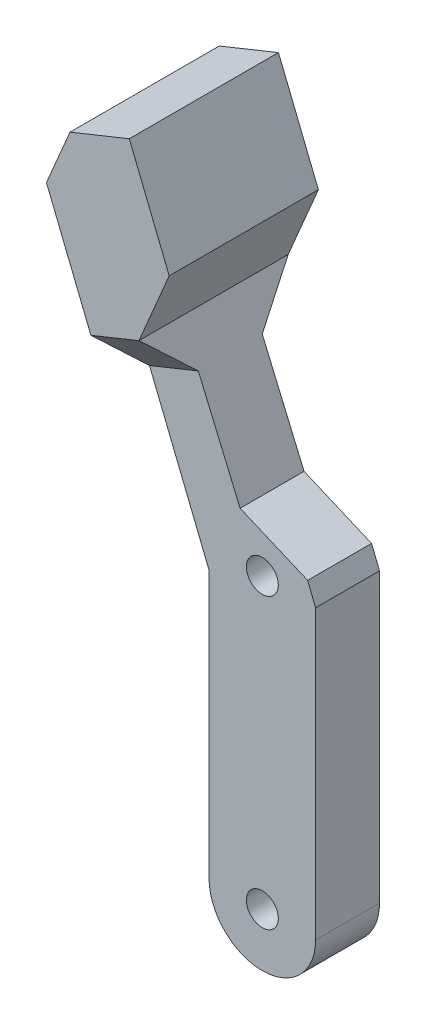
ISO-10303-21;
HEADER;
FILE_DESCRIPTION(('STEP AP214'),'2;1');
FILE_NAME('part.step','',(''),(''),'','','');
FILE_SCHEMA(('AUTOMOTIVE_DESIGN { 1 0 10303 214 1 1 1 1 }'));
ENDSEC;
DATA;
#1=APPLICATION_CONTEXT('core data for automotive mechanical design processes');
#2=APPLICATION_PROTOCOL_DEFINITION('international standard','automotive_design',2000,#1);
#3=PRODUCT_CONTEXT('',#1,'mechanical');
#4=PRODUCT('Part','Part','',(#3));
#5=PRODUCT_RELATED_PRODUCT_CATEGORY('part','',(#4));
#6=PRODUCT_DEFINITION_FORMATION('','',#4);
#7=PRODUCT_DEFINITION_CONTEXT('part definition',#1,'design');
#8=PRODUCT_DEFINITION('design','',#6,#7);
#9=PRODUCT_DEFINITION_SHAPE('','',#8);
#10=(LENGTH_UNIT() NAMED_UNIT(*) SI_UNIT(.MILLI.,.METRE.));
#11=(NAMED_UNIT(*) PLANE_ANGLE_UNIT() SI_UNIT($,.RADIAN.));
#12=(NAMED_UNIT(*) SI_UNIT($,.STERADIAN.) SOLID_ANGLE_UNIT());
#13=UNCERTAINTY_MEASURE_WITH_UNIT(LENGTH_MEASURE(1.E-05),#10,'distance_accuracy_value','');
#14=(GEOMETRIC_REPRESENTATION_CONTEXT(3) GLOBAL_UNCERTAINTY_ASSIGNED_CONTEXT((#13)) GLOBAL_UNIT_ASSIGNED_CONTEXT((#10,
#11,#12)) REPRESENTATION_CONTEXT('',''));
#15=CARTESIAN_POINT('',(0.,0.,0.));
#16=DIRECTION('',(0.,0.,1.));
#17=DIRECTION('',(1.,0.,0.));
#18=AXIS2_PLACEMENT_3D('',#15,#16,#17);
#19=CARTESIAN_POINT('',(0.,0.,6.));
#20=DIRECTION('',(0.,0.,-1.));
#21=DIRECTION('',(-1.,0.,0.));
#22=AXIS2_PLACEMENT_3D('',#19,#20,#21);
#23=CYLINDRICAL_SURFACE('',#22,5.);
#24=CARTESIAN_POINT('',(0.,0.,0.));
#25=DIRECTION('',(0.,0.,1.));
#26=DIRECTION('',(1.,0.,0.));
#27=AXIS2_PLACEMENT_3D('',#24,#25,#26);
#28=CIRCLE('',#27,5.);
#29=CARTESIAN_POINT('',(-5.,0.,0.));
#30=VERTEX_POINT('',#29);
#31=CARTESIAN_POINT('',(5.,0.,0.));
#32=VERTEX_POINT('',#31);
#33=EDGE_CURVE('E197',#30,#32,#28,.T.);
#34=ORIENTED_EDGE('',*,*,#33,.T.);
#35=DIRECTION('',(0.,0.,-1.));
#36=VECTOR('',#35,1.);
#37=CARTESIAN_POINT('',(5.,0.,6.));
#38=LINE('',#37,#36);
#39=CARTESIAN_POINT('',(5.,0.,6.));
#40=VERTEX_POINT('',#39);
#41=EDGE_CURVE('E249',#40,#32,#38,.T.);
#42=ORIENTED_EDGE('',*,*,#41,.F.);
#43=CARTESIAN_POINT('',(0.,0.,6.));
#44=DIRECTION('',(0.,0.,1.));
#45=DIRECTION('',(1.,0.,0.));
#46=AXIS2_PLACEMENT_3D('',#43,#44,#45);
#47=CIRCLE('',#46,5.);
#48=CARTESIAN_POINT('',(-5.,0.,6.));
#49=VERTEX_POINT('',#48);
#50=EDGE_CURVE('E206',#49,#40,#47,.T.);
#51=ORIENTED_EDGE('',*,*,#50,.F.);
#52=DIRECTION('',(0.,0.,-1.));
#53=VECTOR('',#52,1.);
#54=CARTESIAN_POINT('',(-5.,0.,6.));
#55=LINE('',#54,#53);
#56=EDGE_CURVE('E218',#49,#30,#55,.T.);
#57=ORIENTED_EDGE('',*,*,#56,.T.);
#58=EDGE_LOOP('',(#34,#42,#51,#57));
#59=FACE_BOUND('',#58,.T.);
#60=ADVANCED_FACE('F43',(#59),#23,.T.);
#61=CARTESIAN_POINT('',(5.,0.,6.));
#62=DIRECTION('',(-1.,0.,0.));
#63=DIRECTION('',(0.,0.,1.));
#64=AXIS2_PLACEMENT_3D('',#61,#62,#63);
#65=PLANE('',#64);
#66=DIRECTION('',(0.,1.,0.));
#67=VECTOR('',#66,1.);
#68=CARTESIAN_POINT('',(5.,0.,0.));
#69=LINE('',#68,#67);
#70=CARTESIAN_POINT('',(5.,27.,0.));
#71=VERTEX_POINT('',#70);
#72=EDGE_CURVE('E221',#32,#71,#69,.T.);
#73=ORIENTED_EDGE('',*,*,#72,.T.);
#74=DIRECTION('',(0.,0.,-1.));
#75=VECTOR('',#74,1.);
#76=CARTESIAN_POINT('',(5.,27.,6.));
#77=LINE('',#76,#75);
#78=CARTESIAN_POINT('',(5.,27.,6.));
#79=VERTEX_POINT('',#78);
#80=EDGE_CURVE('E246',#79,#71,#77,.T.);
#81=ORIENTED_EDGE('',*,*,#80,.F.);
#82=DIRECTION('',(0.,1.,0.));
#83=VECTOR('',#82,1.);
#84=CARTESIAN_POINT('',(5.,0.,6.));
#85=LINE('',#84,#83);
#86=EDGE_CURVE('E209',#40,#79,#85,.T.);
#87=ORIENTED_EDGE('',*,*,#86,.F.);
#88=ORIENTED_EDGE('',*,*,#41,.T.);
#89=EDGE_LOOP('',(#73,#81,#87,#88));
#90=FACE_BOUND('',#89,.T.);
#91=ADVANCED_FACE('F295',(#90),#65,.F.);
#92=CARTESIAN_POINT('',(5.,27.,6.));
#93=DIRECTION('',(-0.927183854566787,-0.374606593415913,0.));
#94=DIRECTION('',(0.374606593415913,-0.927183854566787,0.));
#95=AXIS2_PLACEMENT_3D('',#92,#93,#94);
#96=PLANE('',#95);
#97=DIRECTION('',(-0.374606593415913,0.927183854566787,0.));
#98=VECTOR('',#97,1.);
#99=CARTESIAN_POINT('',(5.,27.,0.));
#100=LINE('',#99,#98);
#101=CARTESIAN_POINT('',(4.25078681316817,28.8543677091336,0.));
#102=VERTEX_POINT('',#101);
#103=EDGE_CURVE('E223',#71,#102,#100,.T.);
#104=ORIENTED_EDGE('',*,*,#103,.T.);
#105=DIRECTION('',(0.,0.,-1.));
#106=VECTOR('',#105,1.);
#107=CARTESIAN_POINT('',(4.25078681316817,28.8543677091336,6.));
#108=LINE('',#107,#106);
#109=CARTESIAN_POINT('',(4.25078681316817,28.8543677091336,6.));
#110=VERTEX_POINT('',#109);
#111=EDGE_CURVE('E243',#110,#102,#108,.T.);
#112=ORIENTED_EDGE('',*,*,#111,.F.);
#113=DIRECTION('',(-0.374606593415913,0.927183854566787,0.));
#114=VECTOR('',#113,1.);
#115=CARTESIAN_POINT('',(5.,27.,6.));
#116=LINE('',#115,#114);
#117=EDGE_CURVE('E212',#79,#110,#116,.T.);
#118=ORIENTED_EDGE('',*,*,#117,.F.);
#119=ORIENTED_EDGE('',*,*,#80,.T.);
#120=EDGE_LOOP('',(#104,#112,#118,#119));
#121=FACE_BOUND('',#120,.T.);
#122=ADVANCED_FACE('F301',(#121),#96,.F.);
#123=CARTESIAN_POINT('',(4.25078681316817,28.8543677091336,6.));
#124=DIRECTION('',(-0.39073112848927,-0.920504853452442,0.));
#125=DIRECTION('',(0.920504853452442,-0.39073112848927,0.));
#126=AXIS2_PLACEMENT_3D('',#123,#124,#125);
#127=PLANE('',#126);
#128=DIRECTION('',(-0.920504853452442,0.39073112848927,0.));
#129=VECTOR('',#128,1.);
#130=CARTESIAN_POINT('',(4.25078681316817,28.8543677091336,0.));
#131=LINE('',#130,#129);
#132=CARTESIAN_POINT('',(-2.0858861098943,31.5441257835309,0.));
#133=VERTEX_POINT('',#132);
#134=EDGE_CURVE('E225',#102,#133,#131,.T.);
#135=ORIENTED_EDGE('',*,*,#134,.T.);
#136=DIRECTION('',(0.,0.,-1.));
#137=VECTOR('',#136,1.);
#138=CARTESIAN_POINT('',(-2.0858861098943,31.5441257835309,6.));
#139=LINE('',#138,#137);
#140=CARTESIAN_POINT('',(-2.0858861098943,31.5441257835309,6.));
#141=VERTEX_POINT('',#140);
#142=EDGE_CURVE('E241',#141,#133,#139,.T.);
#143=ORIENTED_EDGE('',*,*,#142,.F.);
#144=DIRECTION('',(-0.920504853452442,0.39073112848927,0.));
#145=VECTOR('',#144,1.);
#146=CARTESIAN_POINT('',(4.25078681316817,28.8543677091336,6.));
#147=LINE('',#146,#145);
#148=EDGE_CURVE('E148',#110,#141,#147,.T.);
#149=ORIENTED_EDGE('',*,*,#148,.F.);
#150=ORIENTED_EDGE('',*,*,#111,.T.);
#151=EDGE_LOOP('',(#135,#143,#149,#150));
#152=FACE_BOUND('',#151,.T.);
#153=ADVANCED_FACE('F292',(#152),#127,.F.);
#154=CARTESIAN_POINT('',(-2.0858861098943,31.5441257835309,6.));
#155=DIRECTION('',(-0.919864459095111,-0.39223637885038,0.));
#156=DIRECTION('',(0.39223637885038,-0.919864459095111,0.));
#157=AXIS2_PLACEMENT_3D('',#154,#155,#156);
#158=PLANE('',#157);
#159=DIRECTION('',(-0.39223637885038,0.919864459095111,0.));
#160=VECTOR('',#159,1.);
#161=CARTESIAN_POINT('',(-2.0858861098943,31.5441257835309,0.));
#162=LINE('',#161,#160);
#163=CARTESIAN_POINT('',(-6.00796399786317,40.7420998865948,0.));
#164=VERTEX_POINT('',#163);
#165=EDGE_CURVE('E163',#133,#164,#162,.T.);
#166=ORIENTED_EDGE('',*,*,#165,.T.);
#167=DIRECTION('',(-0.277378270135699,0.650501652016425,-0.707042357981775));
#168=VECTOR('',#167,1.);
#169=CARTESIAN_POINT('',(-2.86985861980017,33.3826815311737,7.99908884360511));
#170=LINE('',#169,#168);
#171=CARTESIAN_POINT('',(-7.57719541379962,44.4222282108624,-4.));
#172=VERTEX_POINT('',#171);
#173=EDGE_CURVE('E52',#164,#172,#170,.T.);
#174=ORIENTED_EDGE('',*,*,#173,.T.);
#175=DIRECTION('',(0.,0.,-1.));
#176=VECTOR('',#175,1.);
#177=CARTESIAN_POINT('',(-7.57719541379962,44.4222282108624,6.));
#178=LINE('',#177,#176);
#179=CARTESIAN_POINT('',(-7.57719541379962,44.4222282108624,10.));
#180=VERTEX_POINT('',#179);
#181=EDGE_CURVE('E59',#180,#172,#178,.T.);
#182=ORIENTED_EDGE('',*,*,#181,.F.);
#183=DIRECTION('',(-0.277378270135696,0.650501652016418,0.707042357981783));
#184=VECTOR('',#183,1.);
#185=CARTESIAN_POINT('',(-4.04656773681812,36.1422748626503,1.00036453227745));
#186=LINE('',#185,#184);
#187=CARTESIAN_POINT('',(-6.00796399786318,40.7420998865948,6.));
#188=VERTEX_POINT('',#187);
#189=EDGE_CURVE('E130',#180,#188,#186,.F.);
#190=ORIENTED_EDGE('',*,*,#189,.T.);
#191=DIRECTION('',(-0.39223637885038,0.919864459095111,0.));
#192=VECTOR('',#191,1.);
#193=CARTESIAN_POINT('',(-2.0858861098943,31.5441257835309,6.));
#194=LINE('',#193,#192);
#195=EDGE_CURVE('E135',#141,#188,#194,.T.);
#196=ORIENTED_EDGE('',*,*,#195,.F.);
#197=ORIENTED_EDGE('',*,*,#142,.T.);
#198=EDGE_LOOP('',(#166,#174,#182,#190,#196,#197));
#199=FACE_BOUND('',#198,.T.);
#200=ADVANCED_FACE('F133',(#199),#158,.F.);
#201=CARTESIAN_POINT('',(-7.57719541379962,44.4222282108624,6.));
#202=DIRECTION('',(-0.92050485345244,0.390731128489274,0.));
#203=DIRECTION('',(-0.390731128489274,-0.92050485345244,0.));
#204=AXIS2_PLACEMENT_3D('',#201,#202,#203);
#205=PLANE('',#204);
#206=ORIENTED_EDGE('',*,*,#181,.T.);
#207=DIRECTION('',(-0.390731128489274,-0.92050485345244,0.));
#208=VECTOR('',#207,1.);
#209=CARTESIAN_POINT('',(-7.57719541379962,44.4222282108624,-4.));
#210=LINE('',#209,#208);
#211=CARTESIAN_POINT('',(-4.73977142881374,51.1067802187365,-4.));
#212=VERTEX_POINT('',#211);
#213=EDGE_CURVE('E172',#212,#172,#210,.T.);
#214=ORIENTED_EDGE('',*,*,#213,.F.);
#215=DIRECTION('',(0.,0.,-1.));
#216=VECTOR('',#215,1.);
#217=CARTESIAN_POINT('',(-4.73977142881374,51.1067802187365,6.));
#218=LINE('',#217,#216);
#219=CARTESIAN_POINT('',(-4.73977142881374,51.1067802187365,10.));
#220=VERTEX_POINT('',#219);
#221=EDGE_CURVE('E85',#220,#212,#218,.T.);
#222=ORIENTED_EDGE('',*,*,#221,.F.);
#223=DIRECTION('',(-0.390731128489274,-0.92050485345244,0.));
#224=VECTOR('',#223,1.);
#225=CARTESIAN_POINT('',(-7.57719541379962,44.4222282108624,10.));
#226=LINE('',#225,#224);
#227=EDGE_CURVE('E189',#220,#180,#226,.T.);
#228=ORIENTED_EDGE('',*,*,#227,.T.);
#229=EDGE_LOOP('',(#206,#214,#222,#228));
#230=FACE_BOUND('',#229,.T.);
#231=ADVANCED_FACE('F281',(#230),#205,.F.);
#232=CARTESIAN_POINT('',(-4.73977142881374,51.1067802187365,6.));
#233=DIRECTION('',(-0.927183854566787,-0.374606593415913,0.));
#234=DIRECTION('',(0.374606593415913,-0.927183854566787,0.));
#235=AXIS2_PLACEMENT_3D('',#232,#233,#234);
#236=PLANE('',#235);
#237=ORIENTED_EDGE('',*,*,#221,.T.);
#238=DIRECTION('',(0.374606593415913,-0.927183854566787,0.));
#239=VECTOR('',#238,1.);
#240=CARTESIAN_POINT('',(-4.73977142881374,51.1067802187365,-4.));
#241=LINE('',#240,#239);
#242=CARTESIAN_POINT('',(-8.48583736297288,60.3786187644043,-4.));
#243=VERTEX_POINT('',#242);
#244=EDGE_CURVE('E177',#243,#212,#241,.T.);
#245=ORIENTED_EDGE('',*,*,#244,.F.);
#246=DIRECTION('',(0.,0.,-1.));
#247=VECTOR('',#246,1.);
#248=CARTESIAN_POINT('',(-8.48583736297288,60.3786187644043,6.));
#249=LINE('',#248,#247);
#250=CARTESIAN_POINT('',(-8.48583736297288,60.3786187644043,10.));
#251=VERTEX_POINT('',#250);
#252=EDGE_CURVE('E236',#251,#243,#249,.T.);
#253=ORIENTED_EDGE('',*,*,#252,.F.);
#254=DIRECTION('',(0.374606593415913,-0.927183854566787,0.));
#255=VECTOR('',#254,1.);
#256=CARTESIAN_POINT('',(-4.73977142881374,51.1067802187365,10.));
#257=LINE('',#256,#255);
#258=EDGE_CURVE('E186',#251,#220,#257,.T.);
#259=ORIENTED_EDGE('',*,*,#258,.T.);
#260=EDGE_LOOP('',(#237,#245,#253,#259));
#261=FACE_BOUND('',#260,.T.);
#262=ADVANCED_FACE('F283',(#261),#236,.F.);
#263=CARTESIAN_POINT('',(-8.48583736297288,60.3786187644043,6.));
#264=DIRECTION('',(0.374606593415917,-0.927183854566785,0.));
#265=DIRECTION('',(0.927183854566785,0.374606593415917,0.));
#266=AXIS2_PLACEMENT_3D('',#263,#264,#265);
#267=PLANE('',#266);
#268=ORIENTED_EDGE('',*,*,#252,.T.);
#269=DIRECTION('',(0.927183854566785,0.374606593415917,0.));
#270=VECTOR('',#269,1.);
#271=CARTESIAN_POINT('',(-8.48583736297288,60.3786187644043,-4.));
#272=LINE('',#271,#270);
#273=CARTESIAN_POINT('',(-14.0489404903736,58.1309792039088,-4.));
#274=VERTEX_POINT('',#273);
#275=EDGE_CURVE('E270',#274,#243,#272,.T.);
#276=ORIENTED_EDGE('',*,*,#275,.F.);
#277=DIRECTION('',(0.,0.,1.));
#278=VECTOR('',#277,1.);
#279=CARTESIAN_POINT('',(-14.0489404903736,58.1309792039088,6.));
#280=LINE('',#279,#278);
#281=CARTESIAN_POINT('',(-14.0489404903736,58.1309792039088,10.));
#282=VERTEX_POINT('',#281);
#283=EDGE_CURVE('E154',#274,#282,#280,.T.);
#284=ORIENTED_EDGE('',*,*,#283,.T.);
#285=DIRECTION('',(0.927183854566785,0.374606593415917,0.));
#286=VECTOR('',#285,1.);
#287=CARTESIAN_POINT('',(-8.48583736297288,60.3786187644043,10.));
#288=LINE('',#287,#286);
#289=EDGE_CURVE('E183',#282,#251,#288,.T.);
#290=ORIENTED_EDGE('',*,*,#289,.T.);
#291=EDGE_LOOP('',(#268,#276,#284,#290));
#292=FACE_BOUND('',#291,.T.);
#293=ADVANCED_FACE('F290',(#292),#267,.F.);
#294=CARTESIAN_POINT('',(-17.7576759086407,56.6325528302452,6.));
#295=DIRECTION('',(0.927183854566785,0.374606593415917,0.));
#296=DIRECTION('',(-0.374606593415917,0.927183854566786,0.));
#297=AXIS2_PLACEMENT_3D('',#294,#295,#296);
#298=PLANE('',#297);
#299=DIRECTION('',(0.374606593415917,-0.927183854566785,0.));
#300=VECTOR('',#299,1.);
#301=CARTESIAN_POINT('',(-17.7576759086407,56.6325528302452,6.));
#302=LINE('',#301,#300);
#303=CARTESIAN_POINT('',(-10.5896195893738,38.8909908698802,6.));
#304=VERTEX_POINT('',#303);
#305=CARTESIAN_POINT('',(-5.,25.0561969086231,6.));
#306=VERTEX_POINT('',#305);
#307=EDGE_CURVE('E150',#304,#306,#302,.T.);
#308=ORIENTED_EDGE('',*,*,#307,.F.);
#309=DIRECTION('',(0.264886862481586,-0.655617990970853,-0.70710678118655));
#310=VECTOR('',#309,1.);
#311=CARTESIAN_POINT('',(-14.1736477490072,47.7617718500626,15.5674454818103));
#312=LINE('',#311,#310);
#313=CARTESIAN_POINT('',(-12.0880459630375,42.5997262881474,10.));
#314=VERTEX_POINT('',#313);
#315=EDGE_CURVE('E139',#304,#314,#312,.F.);
#316=ORIENTED_EDGE('',*,*,#315,.T.);
#317=DIRECTION('',(-0.374606593415917,0.927183854566786,0.));
#318=VECTOR('',#317,1.);
#319=CARTESIAN_POINT('',(-12.0880459630375,42.5997262881474,10.));
#320=LINE('',#319,#318);
#321=CARTESIAN_POINT('',(-16.2592495349771,52.923817411978,10.));
#322=VERTEX_POINT('',#321);
#323=EDGE_CURVE('E171',#314,#322,#320,.T.);
#324=ORIENTED_EDGE('',*,*,#323,.T.);
#325=DIRECTION('',(0.,0.,-1.));
#326=VECTOR('',#325,1.);
#327=CARTESIAN_POINT('',(-16.2592495349771,52.923817411978,6.));
#328=LINE('',#327,#326);
#329=CARTESIAN_POINT('',(-16.2592495349771,52.923817411978,-4.));
#330=VERTEX_POINT('',#329);
#331=EDGE_CURVE('E158',#322,#330,#328,.T.);
#332=ORIENTED_EDGE('',*,*,#331,.T.);
#333=DIRECTION('',(-0.374606593415917,0.927183854566786,0.));
#334=VECTOR('',#333,1.);
#335=CARTESIAN_POINT('',(-12.0880459630375,42.5997262881474,-4.));
#336=LINE('',#335,#334);
#337=CARTESIAN_POINT('',(-12.0880459630375,42.5997262881474,-4.));
#338=VERTEX_POINT('',#337);
#339=EDGE_CURVE('E257',#338,#330,#336,.T.);
#340=ORIENTED_EDGE('',*,*,#339,.F.);
#341=DIRECTION('',(0.264886862481588,-0.65561799097086,0.707106781186543));
#342=VECTOR('',#341,1.);
#343=CARTESIAN_POINT('',(-13.0498279687596,44.9802202863624,-6.56744548181036));
#344=LINE('',#343,#342);
#345=CARTESIAN_POINT('',(-10.5896195893738,38.8909908698802,0.));
#346=VERTEX_POINT('',#345);
#347=EDGE_CURVE('E11',#338,#346,#344,.T.);
#348=ORIENTED_EDGE('',*,*,#347,.T.);
#349=DIRECTION('',(0.374606593415917,-0.927183854566785,0.));
#350=VECTOR('',#349,1.);
#351=CARTESIAN_POINT('',(-17.7576759086407,56.6325528302452,0.));
#352=LINE('',#351,#350);
#353=CARTESIAN_POINT('',(-5.,25.0561969086231,0.));
#354=VERTEX_POINT('',#353);
#355=EDGE_CURVE('E228',#346,#354,#352,.T.);
#356=ORIENTED_EDGE('',*,*,#355,.T.);
#357=DIRECTION('',(0.,0.,-1.));
#358=VECTOR('',#357,1.);
#359=CARTESIAN_POINT('',(-5.,25.0561969086231,6.));
#360=LINE('',#359,#358);
#361=EDGE_CURVE('E233',#306,#354,#360,.T.);
#362=ORIENTED_EDGE('',*,*,#361,.F.);
#363=EDGE_LOOP('',(#308,#316,#324,#332,#340,#348,#356,#362));
#364=FACE_BOUND('',#363,.T.);
#365=ADVANCED_FACE('F256',(#364),#298,.F.);
#366=CARTESIAN_POINT('',(-5.,0.,6.));
#367=DIRECTION('',(1.,0.,0.));
#368=DIRECTION('',(0.,1.,0.));
#369=AXIS2_PLACEMENT_3D('',#366,#367,#368);
#370=PLANE('',#369);
#371=DIRECTION('',(0.,-1.,0.));
#372=VECTOR('',#371,1.);
#373=CARTESIAN_POINT('',(-5.,0.,0.));
#374=LINE('',#373,#372);
#375=EDGE_CURVE('E210',#354,#30,#374,.T.);
#376=ORIENTED_EDGE('',*,*,#375,.T.);
#377=ORIENTED_EDGE('',*,*,#56,.F.);
#378=DIRECTION('',(0.,-1.,0.));
#379=VECTOR('',#378,1.);
#380=CARTESIAN_POINT('',(-5.,0.,6.));
#381=LINE('',#380,#379);
#382=EDGE_CURVE('E216',#306,#49,#381,.T.);
#383=ORIENTED_EDGE('',*,*,#382,.F.);
#384=ORIENTED_EDGE('',*,*,#361,.T.);
#385=EDGE_LOOP('',(#376,#377,#383,#384));
#386=FACE_BOUND('',#385,.T.);
#387=ADVANCED_FACE('F337',(#386),#370,.F.);
#388=CARTESIAN_POINT('',(0.,0.,6.));
#389=DIRECTION('',(0.,0.,1.));
#390=DIRECTION('',(1.,0.,0.));
#391=AXIS2_PLACEMENT_3D('',#388,#389,#390);
#392=PLANE('',#391);
#393=ORIENTED_EDGE('',*,*,#195,.T.);
#394=DIRECTION('',(-0.927183854566785,-0.374606593415917,0.));
#395=VECTOR('',#394,1.);
#396=CARTESIAN_POINT('',(-10.5896195893738,38.8909908698802,6.));
#397=LINE('',#396,#395);
#398=EDGE_CURVE('E145',#188,#304,#397,.T.);
#399=ORIENTED_EDGE('',*,*,#398,.T.);
#400=ORIENTED_EDGE('',*,*,#307,.T.);
#401=ORIENTED_EDGE('',*,*,#382,.T.);
#402=ORIENTED_EDGE('',*,*,#50,.T.);
#403=ORIENTED_EDGE('',*,*,#86,.T.);
#404=ORIENTED_EDGE('',*,*,#117,.T.);
#405=ORIENTED_EDGE('',*,*,#148,.T.);
#406=EDGE_LOOP('',(#393,#399,#400,#401,#402,#403,#404,#405));
#407=FACE_BOUND('',#406,.T.);
#408=CARTESIAN_POINT('',(0.,27.0885766500311,6.));
#409=DIRECTION('',(0.,0.,1.));
#410=DIRECTION('',(1.,0.,0.));
#411=AXIS2_PLACEMENT_3D('',#408,#409,#410);
#412=CIRCLE('',#411,1.5);
#413=CARTESIAN_POINT('',(1.5,27.0885766500311,6.));
#414=VERTEX_POINT('',#413);
#415=EDGE_CURVE('E198',#414,#414,#412,.T.);
#416=ORIENTED_EDGE('',*,*,#415,.F.);
#417=EDGE_LOOP('',(#416));
#418=FACE_BOUND('',#417,.T.);
#419=CARTESIAN_POINT('',(0.,0.,6.));
#420=DIRECTION('',(0.,0.,1.));
#421=DIRECTION('',(1.,0.,0.));
#422=AXIS2_PLACEMENT_3D('',#419,#420,#421);
#423=CIRCLE('',#422,1.5);
#424=CARTESIAN_POINT('',(1.5,0.,6.));
#425=VERTEX_POINT('',#424);
#426=EDGE_CURVE('E201',#425,#425,#423,.T.);
#427=ORIENTED_EDGE('',*,*,#426,.F.);
#428=EDGE_LOOP('',(#427));
#429=FACE_BOUND('',#428,.T.);
#430=ADVANCED_FACE('F143',(#407,#418,#429),#392,.T.);
#431=CARTESIAN_POINT('',(0.,0.,0.));
#432=DIRECTION('',(0.,0.,1.));
#433=DIRECTION('',(1.,0.,0.));
#434=AXIS2_PLACEMENT_3D('',#431,#432,#433);
#435=PLANE('',#434);
#436=CARTESIAN_POINT('',(0.,27.0885766500311,0.));
#437=DIRECTION('',(0.,0.,1.));
#438=DIRECTION('',(1.,0.,0.));
#439=AXIS2_PLACEMENT_3D('',#436,#437,#438);
#440=CIRCLE('',#439,1.5);
#441=CARTESIAN_POINT('',(1.5,27.0885766500311,0.));
#442=VERTEX_POINT('',#441);
#443=EDGE_CURVE('E194',#442,#442,#440,.T.);
#444=ORIENTED_EDGE('',*,*,#443,.T.);
#445=EDGE_LOOP('',(#444));
#446=FACE_BOUND('',#445,.T.);
#447=CARTESIAN_POINT('',(0.,0.,0.));
#448=DIRECTION('',(0.,0.,1.));
#449=DIRECTION('',(1.,0.,0.));
#450=AXIS2_PLACEMENT_3D('',#447,#448,#449);
#451=CIRCLE('',#450,1.5);
#452=CARTESIAN_POINT('',(1.5,0.,0.));
#453=VERTEX_POINT('',#452);
#454=EDGE_CURVE('E193',#453,#453,#451,.T.);
#455=ORIENTED_EDGE('',*,*,#454,.T.);
#456=EDGE_LOOP('',(#455));
#457=FACE_BOUND('',#456,.T.);
#458=ORIENTED_EDGE('',*,*,#355,.F.);
#459=DIRECTION('',(0.927183854566785,0.374606593415917,0.));
#460=VECTOR('',#459,1.);
#461=CARTESIAN_POINT('',(-14.9940185457493,37.1114981824635,0.));
#462=LINE('',#461,#460);
#463=EDGE_CURVE('E140',#346,#164,#462,.T.);
#464=ORIENTED_EDGE('',*,*,#463,.T.);
#465=ORIENTED_EDGE('',*,*,#165,.F.);
#466=ORIENTED_EDGE('',*,*,#134,.F.);
#467=ORIENTED_EDGE('',*,*,#103,.F.);
#468=ORIENTED_EDGE('',*,*,#72,.F.);
#469=ORIENTED_EDGE('',*,*,#33,.F.);
#470=ORIENTED_EDGE('',*,*,#375,.F.);
#471=EDGE_LOOP('',(#458,#464,#465,#466,#467,#468,#469,#470));
#472=FACE_BOUND('',#471,.T.);
#473=ADVANCED_FACE('F312',(#446,#457,#472),#435,.F.);
#474=CARTESIAN_POINT('',(-16.2592495349771,52.923817411978,6.));
#475=DIRECTION('',(0.920504853452441,-0.390731128489271,0.));
#476=DIRECTION('',(0.,0.,-1.));
#477=AXIS2_PLACEMENT_3D('',#474,#475,#476);
#478=PLANE('',#477);
#479=ORIENTED_EDGE('',*,*,#331,.F.);
#480=DIRECTION('',(0.390731128489272,0.920504853452441,0.));
#481=VECTOR('',#480,1.);
#482=CARTESIAN_POINT('',(-16.2592495349771,52.923817411978,10.));
#483=LINE('',#482,#481);
#484=EDGE_CURVE('E175',#322,#282,#483,.T.);
#485=ORIENTED_EDGE('',*,*,#484,.T.);
#486=ORIENTED_EDGE('',*,*,#283,.F.);
#487=DIRECTION('',(0.390731128489272,0.920504853452441,0.));
#488=VECTOR('',#487,1.);
#489=CARTESIAN_POINT('',(-16.2592495349771,52.923817411978,-4.));
#490=LINE('',#489,#488);
#491=EDGE_CURVE('E266',#330,#274,#490,.T.);
#492=ORIENTED_EDGE('',*,*,#491,.F.);
#493=EDGE_LOOP('',(#479,#485,#486,#492));
#494=FACE_BOUND('',#493,.T.);
#495=ADVANCED_FACE('F267',(#494),#478,.F.);
#496=CARTESIAN_POINT('',(0.,0.,0.));
#497=DIRECTION('',(0.,0.,1.));
#498=DIRECTION('',(1.,0.,0.));
#499=AXIS2_PLACEMENT_3D('',#496,#497,#498);
#500=CYLINDRICAL_SURFACE('',#499,1.5);
#501=ORIENTED_EDGE('',*,*,#454,.F.);
#502=EDGE_LOOP('',(#501));
#503=FACE_BOUND('',#502,.T.);
#504=ORIENTED_EDGE('',*,*,#426,.T.);
#505=EDGE_LOOP('',(#504));
#506=FACE_BOUND('',#505,.T.);
#507=ADVANCED_FACE('F311',(#503,#506),#500,.F.);
#508=CARTESIAN_POINT('',(0.,27.0885766500311,0.));
#509=DIRECTION('',(0.,0.,1.));
#510=DIRECTION('',(1.,0.,0.));
#511=AXIS2_PLACEMENT_3D('',#508,#509,#510);
#512=CYLINDRICAL_SURFACE('',#511,1.5);
#513=ORIENTED_EDGE('',*,*,#443,.F.);
#514=EDGE_LOOP('',(#513));
#515=FACE_BOUND('',#514,.T.);
#516=ORIENTED_EDGE('',*,*,#415,.T.);
#517=EDGE_LOOP('',(#516));
#518=FACE_BOUND('',#517,.T.);
#519=ADVANCED_FACE('F326',(#515,#518),#512,.F.);
#520=CARTESIAN_POINT('',(0.,0.,-4.));
#521=DIRECTION('',(0.,0.,1.));
#522=DIRECTION('',(1.,0.,0.));
#523=AXIS2_PLACEMENT_3D('',#520,#521,#522);
#524=PLANE('',#523);
#525=ORIENTED_EDGE('',*,*,#339,.T.);
#526=ORIENTED_EDGE('',*,*,#491,.T.);
#527=ORIENTED_EDGE('',*,*,#275,.T.);
#528=ORIENTED_EDGE('',*,*,#244,.T.);
#529=ORIENTED_EDGE('',*,*,#213,.T.);
#530=DIRECTION('',(-0.927183854566785,-0.374606593415917,0.));
#531=VECTOR('',#530,1.);
#532=CARTESIAN_POINT('',(-7.57719541379962,44.4222282108624,-4.));
#533=LINE('',#532,#531);
#534=EDGE_CURVE('E166',#172,#338,#533,.T.);
#535=ORIENTED_EDGE('',*,*,#534,.T.);
#536=EDGE_LOOP('',(#525,#526,#527,#528,#529,#535));
#537=FACE_BOUND('',#536,.T.);
#538=ADVANCED_FACE('F272',(#537),#524,.F.);
#539=CARTESIAN_POINT('',(0.,0.,10.));
#540=DIRECTION('',(0.,0.,1.));
#541=DIRECTION('',(1.,0.,0.));
#542=AXIS2_PLACEMENT_3D('',#539,#540,#541);
#543=PLANE('',#542);
#544=ORIENTED_EDGE('',*,*,#323,.F.);
#545=DIRECTION('',(-0.927183854566785,-0.374606593415917,0.));
#546=VECTOR('',#545,1.);
#547=CARTESIAN_POINT('',(-7.57719541379962,44.4222282108624,10.));
#548=LINE('',#547,#546);
#549=EDGE_CURVE('E191',#180,#314,#548,.T.);
#550=ORIENTED_EDGE('',*,*,#549,.F.);
#551=ORIENTED_EDGE('',*,*,#227,.F.);
#552=ORIENTED_EDGE('',*,*,#258,.F.);
#553=ORIENTED_EDGE('',*,*,#289,.F.);
#554=ORIENTED_EDGE('',*,*,#484,.F.);
#555=EDGE_LOOP('',(#544,#550,#551,#552,#553,#554));
#556=FACE_BOUND('',#555,.T.);
#557=ADVANCED_FACE('F316',(#556),#543,.T.);
#558=CARTESIAN_POINT('',(-7.57719541379962,44.4222282108624,10.));
#559=DIRECTION('',(0.264886862481588,-0.655617990970858,0.707106781186545));
#560=DIRECTION('',(-0.927183854566785,-0.374606593415917,0.));
#561=AXIS2_PLACEMENT_3D('',#558,#559,#560);
#562=PLANE('',#561);
#563=ORIENTED_EDGE('',*,*,#315,.F.);
#564=ORIENTED_EDGE('',*,*,#398,.F.);
#565=ORIENTED_EDGE('',*,*,#189,.F.);
#566=ORIENTED_EDGE('',*,*,#549,.T.);
#567=EDGE_LOOP('',(#563,#564,#565,#566));
#568=FACE_BOUND('',#567,.T.);
#569=ADVANCED_FACE('F153',(#568),#562,.T.);
#570=CARTESIAN_POINT('',(-14.9940185457493,37.1114981824635,0.));
#571=DIRECTION('',(-0.264886862481585,0.655617990970851,0.707106781186552));
#572=DIRECTION('',(0.927183854566785,0.374606593415917,0.));
#573=AXIS2_PLACEMENT_3D('',#570,#571,#572);
#574=PLANE('',#573);
#575=ORIENTED_EDGE('',*,*,#347,.F.);
#576=ORIENTED_EDGE('',*,*,#534,.F.);
#577=ORIENTED_EDGE('',*,*,#173,.F.);
#578=ORIENTED_EDGE('',*,*,#463,.F.);
#579=EDGE_LOOP('',(#575,#576,#577,#578));
#580=FACE_BOUND('',#579,.T.);
#581=ADVANCED_FACE('F46',(#580),#574,.F.);
#582=CLOSED_SHELL('',(#60,#91,#122,#153,#200,#231,#262,#293,#365,#387,#430,#473,#495,#507,#519,
#538,#557,#569,#581));
#583=MANIFOLD_SOLID_BREP('B2',#582);
#584=ADVANCED_BREP_SHAPE_REPRESENTATION('',(#18,#583),#14);
#585=SHAPE_DEFINITION_REPRESENTATION(#9,#584);
ENDSEC;
END-ISO-10303-21;
